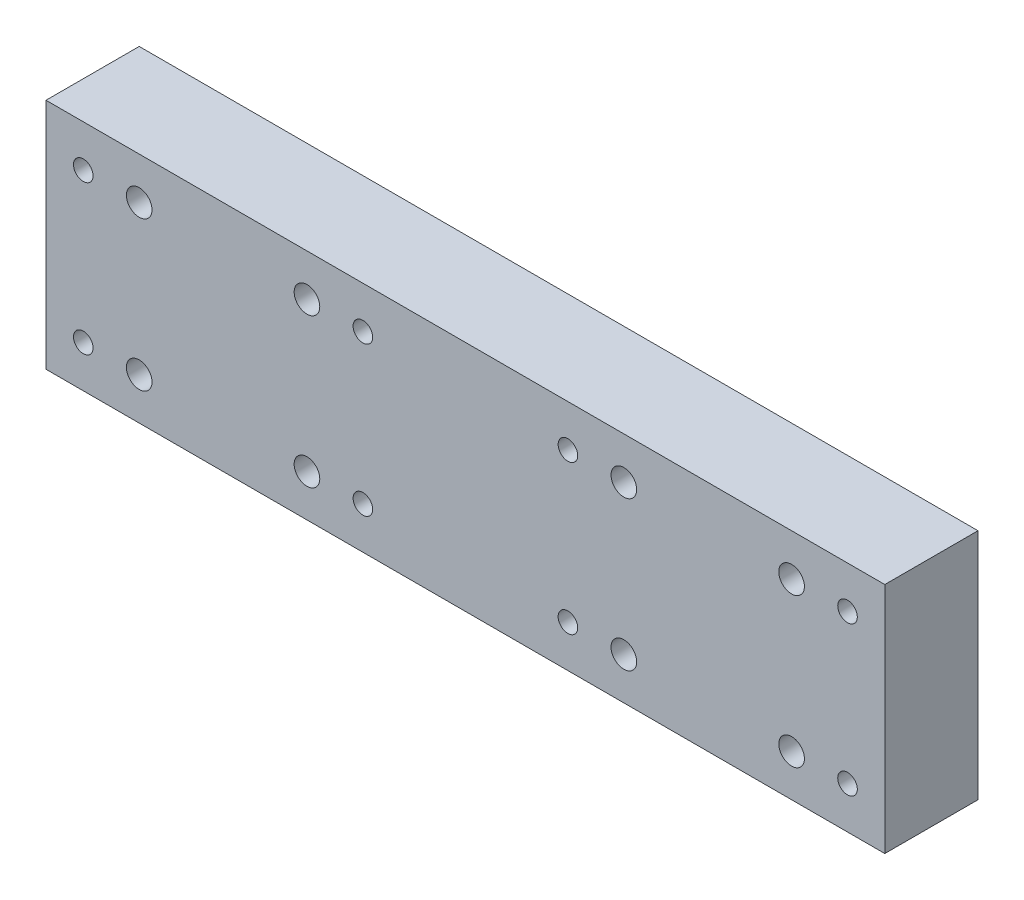
ISO-10303-21;
HEADER;
FILE_DESCRIPTION(('STEP AP214'),'2;1');
FILE_NAME('part.step','',(''),(''),'','','');
FILE_SCHEMA(('AUTOMOTIVE_DESIGN { 1 0 10303 214 1 1 1 1 }'));
ENDSEC;
DATA;
#1=APPLICATION_CONTEXT('core data for automotive mechanical design processes');
#2=APPLICATION_PROTOCOL_DEFINITION('international standard','automotive_design',2000,#1);
#3=PRODUCT_CONTEXT('',#1,'mechanical');
#4=PRODUCT('Part','Part','',(#3));
#5=PRODUCT_RELATED_PRODUCT_CATEGORY('part','',(#4));
#6=PRODUCT_DEFINITION_FORMATION('','',#4);
#7=PRODUCT_DEFINITION_CONTEXT('part definition',#1,'design');
#8=PRODUCT_DEFINITION('design','',#6,#7);
#9=PRODUCT_DEFINITION_SHAPE('','',#8);
#10=(LENGTH_UNIT() NAMED_UNIT(*) SI_UNIT(.MILLI.,.METRE.));
#11=(NAMED_UNIT(*) PLANE_ANGLE_UNIT() SI_UNIT($,.RADIAN.));
#12=(NAMED_UNIT(*) SI_UNIT($,.STERADIAN.) SOLID_ANGLE_UNIT());
#13=UNCERTAINTY_MEASURE_WITH_UNIT(LENGTH_MEASURE(1.E-05),#10,'distance_accuracy_value','');
#14=(GEOMETRIC_REPRESENTATION_CONTEXT(3) GLOBAL_UNCERTAINTY_ASSIGNED_CONTEXT((#13)) GLOBAL_UNIT_ASSIGNED_CONTEXT((#10,
#11,#12)) REPRESENTATION_CONTEXT('',''));
#15=CARTESIAN_POINT('',(0.,0.,0.));
#16=DIRECTION('',(0.,0.,1.));
#17=DIRECTION('',(1.,0.,0.));
#18=AXIS2_PLACEMENT_3D('',#15,#16,#17);
#19=CARTESIAN_POINT('',(-90.,0.,20.));
#20=DIRECTION('',(1.,0.,0.));
#21=DIRECTION('',(0.,0.,-1.));
#22=AXIS2_PLACEMENT_3D('',#19,#20,#21);
#23=PLANE('',#22);
#24=DIRECTION('',(0.,-1.,0.));
#25=VECTOR('',#24,1.);
#26=CARTESIAN_POINT('',(-90.,0.,0.));
#27=LINE('',#26,#25);
#28=CARTESIAN_POINT('',(-90.,50.,0.));
#29=VERTEX_POINT('',#28);
#30=CARTESIAN_POINT('',(-90.,0.,0.));
#31=VERTEX_POINT('',#30);
#32=EDGE_CURVE('E103',#29,#31,#27,.T.);
#33=ORIENTED_EDGE('',*,*,#32,.T.);
#34=DIRECTION('',(0.,0.,-1.));
#35=VECTOR('',#34,1.);
#36=CARTESIAN_POINT('',(-90.,0.,20.));
#37=LINE('',#36,#35);
#38=CARTESIAN_POINT('',(-90.,0.,20.));
#39=VERTEX_POINT('',#38);
#40=EDGE_CURVE('E11',#39,#31,#37,.T.);
#41=ORIENTED_EDGE('',*,*,#40,.F.);
#42=DIRECTION('',(0.,-1.,0.));
#43=VECTOR('',#42,1.);
#44=CARTESIAN_POINT('',(-90.,0.,20.));
#45=LINE('',#44,#43);
#46=CARTESIAN_POINT('',(-90.,50.,20.));
#47=VERTEX_POINT('',#46);
#48=EDGE_CURVE('E90',#47,#39,#45,.T.);
#49=ORIENTED_EDGE('',*,*,#48,.F.);
#50=DIRECTION('',(0.,0.,-1.));
#51=VECTOR('',#50,1.);
#52=CARTESIAN_POINT('',(-90.,50.,20.));
#53=LINE('',#52,#51);
#54=EDGE_CURVE('E99',#47,#29,#53,.T.);
#55=ORIENTED_EDGE('',*,*,#54,.T.);
#56=EDGE_LOOP('',(#33,#41,#49,#55));
#57=FACE_BOUND('',#56,.T.);
#58=ADVANCED_FACE('F37',(#57),#23,.F.);
#59=CARTESIAN_POINT('',(-90.,0.,20.));
#60=DIRECTION('',(0.,1.,0.));
#61=DIRECTION('',(0.,0.,1.));
#62=AXIS2_PLACEMENT_3D('',#59,#60,#61);
#63=PLANE('',#62);
#64=DIRECTION('',(1.,0.,0.));
#65=VECTOR('',#64,1.);
#66=CARTESIAN_POINT('',(-90.,0.,0.));
#67=LINE('',#66,#65);
#68=CARTESIAN_POINT('',(90.,0.,0.));
#69=VERTEX_POINT('',#68);
#70=EDGE_CURVE('E94',#31,#69,#67,.T.);
#71=ORIENTED_EDGE('',*,*,#70,.T.);
#72=DIRECTION('',(0.,0.,-1.));
#73=VECTOR('',#72,1.);
#74=CARTESIAN_POINT('',(90.,0.,20.));
#75=LINE('',#74,#73);
#76=CARTESIAN_POINT('',(90.,0.,20.));
#77=VERTEX_POINT('',#76);
#78=EDGE_CURVE('E46',#77,#69,#75,.T.);
#79=ORIENTED_EDGE('',*,*,#78,.F.);
#80=DIRECTION('',(1.,0.,0.));
#81=VECTOR('',#80,1.);
#82=CARTESIAN_POINT('',(-90.,0.,20.));
#83=LINE('',#82,#81);
#84=EDGE_CURVE('E85',#39,#77,#83,.T.);
#85=ORIENTED_EDGE('',*,*,#84,.F.);
#86=ORIENTED_EDGE('',*,*,#40,.T.);
#87=EDGE_LOOP('',(#71,#79,#85,#86));
#88=FACE_BOUND('',#87,.T.);
#89=ADVANCED_FACE('F93',(#88),#63,.F.);
#90=CARTESIAN_POINT('',(90.,0.,20.));
#91=DIRECTION('',(-1.,0.,0.));
#92=DIRECTION('',(0.,0.,1.));
#93=AXIS2_PLACEMENT_3D('',#90,#91,#92);
#94=PLANE('',#93);
#95=DIRECTION('',(0.,1.,0.));
#96=VECTOR('',#95,1.);
#97=CARTESIAN_POINT('',(90.,0.,0.));
#98=LINE('',#97,#96);
#99=CARTESIAN_POINT('',(90.,50.,0.));
#100=VERTEX_POINT('',#99);
#101=EDGE_CURVE('E72',#69,#100,#98,.T.);
#102=ORIENTED_EDGE('',*,*,#101,.T.);
#103=DIRECTION('',(0.,0.,-1.));
#104=VECTOR('',#103,1.);
#105=CARTESIAN_POINT('',(90.,50.,20.));
#106=LINE('',#105,#104);
#107=CARTESIAN_POINT('',(90.,50.,20.));
#108=VERTEX_POINT('',#107);
#109=EDGE_CURVE('E95',#108,#100,#106,.T.);
#110=ORIENTED_EDGE('',*,*,#109,.F.);
#111=DIRECTION('',(0.,1.,0.));
#112=VECTOR('',#111,1.);
#113=CARTESIAN_POINT('',(90.,0.,20.));
#114=LINE('',#113,#112);
#115=EDGE_CURVE('E88',#77,#108,#114,.T.);
#116=ORIENTED_EDGE('',*,*,#115,.F.);
#117=ORIENTED_EDGE('',*,*,#78,.T.);
#118=EDGE_LOOP('',(#102,#110,#116,#117));
#119=FACE_BOUND('',#118,.T.);
#120=ADVANCED_FACE('F97',(#119),#94,.F.);
#121=CARTESIAN_POINT('',(-90.,50.,20.));
#122=DIRECTION('',(0.,-1.,0.));
#123=DIRECTION('',(0.,0.,-1.));
#124=AXIS2_PLACEMENT_3D('',#121,#122,#123);
#125=PLANE('',#124);
#126=DIRECTION('',(-1.,0.,0.));
#127=VECTOR('',#126,1.);
#128=CARTESIAN_POINT('',(-90.,50.,0.));
#129=LINE('',#128,#127);
#130=EDGE_CURVE('E78',#100,#29,#129,.T.);
#131=ORIENTED_EDGE('',*,*,#130,.T.);
#132=ORIENTED_EDGE('',*,*,#54,.F.);
#133=DIRECTION('',(-1.,0.,0.));
#134=VECTOR('',#133,1.);
#135=CARTESIAN_POINT('',(-90.,50.,20.));
#136=LINE('',#135,#134);
#137=EDGE_CURVE('E55',#108,#47,#136,.T.);
#138=ORIENTED_EDGE('',*,*,#137,.F.);
#139=ORIENTED_EDGE('',*,*,#109,.T.);
#140=EDGE_LOOP('',(#131,#132,#138,#139));
#141=FACE_BOUND('',#140,.T.);
#142=ADVANCED_FACE('F167',(#141),#125,.F.);
#143=CARTESIAN_POINT('',(0.,0.,20.));
#144=DIRECTION('',(0.,0.,-1.));
#145=DIRECTION('',(-1.,0.,0.));
#146=AXIS2_PLACEMENT_3D('',#143,#144,#145);
#147=PLANE('',#146);
#148=CARTESIAN_POINT('',(-82.,41.,20.));
#149=DIRECTION('',(0.,0.,-1.));
#150=DIRECTION('',(-1.,0.,0.));
#151=AXIS2_PLACEMENT_3D('',#148,#149,#150);
#152=CIRCLE('',#151,2.09999999999999);
#153=CARTESIAN_POINT('',(-84.1,41.,20.));
#154=VERTEX_POINT('',#153);
#155=EDGE_CURVE('E530',#154,#154,#152,.T.);
#156=ORIENTED_EDGE('',*,*,#155,.T.);
#157=EDGE_LOOP('',(#156));
#158=FACE_BOUND('',#157,.T.);
#159=CARTESIAN_POINT('',(-22.,41.,20.));
#160=DIRECTION('',(0.,0.,-1.));
#161=DIRECTION('',(-1.,0.,0.));
#162=AXIS2_PLACEMENT_3D('',#159,#160,#161);
#163=CIRCLE('',#162,2.09999999999999);
#164=CARTESIAN_POINT('',(-24.1,41.,20.));
#165=VERTEX_POINT('',#164);
#166=EDGE_CURVE('E534',#165,#165,#163,.T.);
#167=ORIENTED_EDGE('',*,*,#166,.T.);
#168=EDGE_LOOP('',(#167));
#169=FACE_BOUND('',#168,.T.);
#170=CARTESIAN_POINT('',(-82.,9.,20.));
#171=DIRECTION('',(0.,0.,-1.));
#172=DIRECTION('',(-1.,0.,0.));
#173=AXIS2_PLACEMENT_3D('',#170,#171,#172);
#174=CIRCLE('',#173,2.09999999999999);
#175=CARTESIAN_POINT('',(-84.1,9.,20.));
#176=VERTEX_POINT('',#175);
#177=EDGE_CURVE('E543',#176,#176,#174,.T.);
#178=ORIENTED_EDGE('',*,*,#177,.T.);
#179=EDGE_LOOP('',(#178));
#180=FACE_BOUND('',#179,.T.);
#181=CARTESIAN_POINT('',(-22.,9.,20.));
#182=DIRECTION('',(0.,0.,-1.));
#183=DIRECTION('',(-1.,0.,0.));
#184=AXIS2_PLACEMENT_3D('',#181,#182,#183);
#185=CIRCLE('',#184,2.09999999999999);
#186=CARTESIAN_POINT('',(-24.1,9.,20.));
#187=VERTEX_POINT('',#186);
#188=EDGE_CURVE('E549',#187,#187,#185,.T.);
#189=ORIENTED_EDGE('',*,*,#188,.T.);
#190=EDGE_LOOP('',(#189));
#191=FACE_BOUND('',#190,.T.);
#192=CARTESIAN_POINT('',(82.,9.,20.));
#193=DIRECTION('',(0.,0.,-1.));
#194=DIRECTION('',(-1.,0.,0.));
#195=AXIS2_PLACEMENT_3D('',#192,#193,#194);
#196=CIRCLE('',#195,2.09999999999999);
#197=CARTESIAN_POINT('',(79.9,9.,20.));
#198=VERTEX_POINT('',#197);
#199=EDGE_CURVE('E555',#198,#198,#196,.T.);
#200=ORIENTED_EDGE('',*,*,#199,.T.);
#201=EDGE_LOOP('',(#200));
#202=FACE_BOUND('',#201,.T.);
#203=CARTESIAN_POINT('',(82.,41.,20.));
#204=DIRECTION('',(0.,0.,-1.));
#205=DIRECTION('',(-1.,0.,0.));
#206=AXIS2_PLACEMENT_3D('',#203,#204,#205);
#207=CIRCLE('',#206,2.09999999999999);
#208=CARTESIAN_POINT('',(79.9,41.,20.));
#209=VERTEX_POINT('',#208);
#210=EDGE_CURVE('E561',#209,#209,#207,.T.);
#211=ORIENTED_EDGE('',*,*,#210,.T.);
#212=EDGE_LOOP('',(#211));
#213=FACE_BOUND('',#212,.T.);
#214=CARTESIAN_POINT('',(22.,41.,20.));
#215=DIRECTION('',(0.,0.,-1.));
#216=DIRECTION('',(-1.,0.,0.));
#217=AXIS2_PLACEMENT_3D('',#214,#215,#216);
#218=CIRCLE('',#217,2.09999999999999);
#219=CARTESIAN_POINT('',(19.9,41.,20.));
#220=VERTEX_POINT('',#219);
#221=EDGE_CURVE('E567',#220,#220,#218,.T.);
#222=ORIENTED_EDGE('',*,*,#221,.T.);
#223=EDGE_LOOP('',(#222));
#224=FACE_BOUND('',#223,.T.);
#225=CARTESIAN_POINT('',(22.,9.,20.));
#226=DIRECTION('',(0.,0.,-1.));
#227=DIRECTION('',(-1.,0.,0.));
#228=AXIS2_PLACEMENT_3D('',#225,#226,#227);
#229=CIRCLE('',#228,2.09999999999999);
#230=CARTESIAN_POINT('',(19.9,9.,20.));
#231=VERTEX_POINT('',#230);
#232=EDGE_CURVE('E573',#231,#231,#229,.T.);
#233=ORIENTED_EDGE('',*,*,#232,.T.);
#234=EDGE_LOOP('',(#233));
#235=FACE_BOUND('',#234,.T.);
#236=CARTESIAN_POINT('',(70.,9.,20.));
#237=DIRECTION('',(0.,0.,1.));
#238=DIRECTION('',(1.,0.,0.));
#239=AXIS2_PLACEMENT_3D('',#236,#237,#238);
#240=CIRCLE('',#239,2.75000000000001);
#241=CARTESIAN_POINT('',(72.75,9.,20.));
#242=VERTEX_POINT('',#241);
#243=EDGE_CURVE('E148',#242,#242,#240,.T.);
#244=ORIENTED_EDGE('',*,*,#243,.F.);
#245=EDGE_LOOP('',(#244));
#246=FACE_BOUND('',#245,.T.);
#247=CARTESIAN_POINT('',(70.,41.,20.));
#248=DIRECTION('',(0.,0.,1.));
#249=DIRECTION('',(-1.,0.,0.));
#250=AXIS2_PLACEMENT_3D('',#247,#248,#249);
#251=CIRCLE('',#250,2.75000000000001);
#252=CARTESIAN_POINT('',(67.25,41.,20.));
#253=VERTEX_POINT('',#252);
#254=EDGE_CURVE('E151',#253,#253,#251,.T.);
#255=ORIENTED_EDGE('',*,*,#254,.F.);
#256=EDGE_LOOP('',(#255));
#257=FACE_BOUND('',#256,.T.);
#258=CARTESIAN_POINT('',(34.,41.,20.));
#259=DIRECTION('',(0.,0.,1.));
#260=DIRECTION('',(-1.,0.,0.));
#261=AXIS2_PLACEMENT_3D('',#258,#259,#260);
#262=CIRCLE('',#261,2.75);
#263=CARTESIAN_POINT('',(31.25,41.,20.));
#264=VERTEX_POINT('',#263);
#265=EDGE_CURVE('E154',#264,#264,#262,.T.);
#266=ORIENTED_EDGE('',*,*,#265,.F.);
#267=EDGE_LOOP('',(#266));
#268=FACE_BOUND('',#267,.T.);
#269=CARTESIAN_POINT('',(-34.,9.,20.));
#270=DIRECTION('',(0.,0.,1.));
#271=DIRECTION('',(-1.,0.,0.));
#272=AXIS2_PLACEMENT_3D('',#269,#270,#271);
#273=CIRCLE('',#272,2.74999999999999);
#274=CARTESIAN_POINT('',(-36.75,9.,20.));
#275=VERTEX_POINT('',#274);
#276=EDGE_CURVE('E157',#275,#275,#273,.T.);
#277=ORIENTED_EDGE('',*,*,#276,.F.);
#278=EDGE_LOOP('',(#277));
#279=FACE_BOUND('',#278,.T.);
#280=CARTESIAN_POINT('',(-70.,9.,20.));
#281=DIRECTION('',(0.,0.,1.));
#282=DIRECTION('',(-1.,0.,0.));
#283=AXIS2_PLACEMENT_3D('',#280,#281,#282);
#284=CIRCLE('',#283,2.75000000000001);
#285=CARTESIAN_POINT('',(-72.75,9.,20.));
#286=VERTEX_POINT('',#285);
#287=EDGE_CURVE('E144',#286,#286,#284,.T.);
#288=ORIENTED_EDGE('',*,*,#287,.F.);
#289=EDGE_LOOP('',(#288));
#290=FACE_BOUND('',#289,.T.);
#291=CARTESIAN_POINT('',(-70.,41.,20.));
#292=DIRECTION('',(0.,0.,1.));
#293=DIRECTION('',(1.,0.,0.));
#294=AXIS2_PLACEMENT_3D('',#291,#292,#293);
#295=CIRCLE('',#294,2.75000000000001);
#296=CARTESIAN_POINT('',(-67.25,41.,20.));
#297=VERTEX_POINT('',#296);
#298=EDGE_CURVE('E139',#297,#297,#295,.T.);
#299=ORIENTED_EDGE('',*,*,#298,.F.);
#300=EDGE_LOOP('',(#299));
#301=FACE_BOUND('',#300,.T.);
#302=CARTESIAN_POINT('',(-34.,41.,20.));
#303=DIRECTION('',(0.,0.,1.));
#304=DIRECTION('',(1.,0.,0.));
#305=AXIS2_PLACEMENT_3D('',#302,#303,#304);
#306=CIRCLE('',#305,2.75);
#307=CARTESIAN_POINT('',(-31.25,41.,20.));
#308=VERTEX_POINT('',#307);
#309=EDGE_CURVE('E135',#308,#308,#306,.T.);
#310=ORIENTED_EDGE('',*,*,#309,.F.);
#311=EDGE_LOOP('',(#310));
#312=FACE_BOUND('',#311,.T.);
#313=CARTESIAN_POINT('',(34.,9.,20.));
#314=DIRECTION('',(0.,0.,1.));
#315=DIRECTION('',(1.,0.,0.));
#316=AXIS2_PLACEMENT_3D('',#313,#314,#315);
#317=CIRCLE('',#316,2.74999999999999);
#318=CARTESIAN_POINT('',(36.75,9.,20.));
#319=VERTEX_POINT('',#318);
#320=EDGE_CURVE('E106',#319,#319,#317,.T.);
#321=ORIENTED_EDGE('',*,*,#320,.F.);
#322=EDGE_LOOP('',(#321));
#323=FACE_BOUND('',#322,.T.);
#324=ORIENTED_EDGE('',*,*,#48,.T.);
#325=ORIENTED_EDGE('',*,*,#84,.T.);
#326=ORIENTED_EDGE('',*,*,#115,.T.);
#327=ORIENTED_EDGE('',*,*,#137,.T.);
#328=EDGE_LOOP('',(#324,#325,#326,#327));
#329=FACE_BOUND('',#328,.T.);
#330=ADVANCED_FACE('F86',(#158,#169,#180,#191,#202,#213,#224,#235,#246,#257,#268,#279,#290,#301,
#312,#323,#329),#147,.F.);
#331=CARTESIAN_POINT('',(0.,0.,0.));
#332=DIRECTION('',(0.,0.,-1.));
#333=DIRECTION('',(-1.,0.,0.));
#334=AXIS2_PLACEMENT_3D('',#331,#332,#333);
#335=PLANE('',#334);
#336=CARTESIAN_POINT('',(-82.,41.,0.));
#337=DIRECTION('',(0.,0.,-1.));
#338=DIRECTION('',(-1.,0.,0.));
#339=AXIS2_PLACEMENT_3D('',#336,#337,#338);
#340=CIRCLE('',#339,2.09999999999999);
#341=CARTESIAN_POINT('',(-84.1,41.,0.));
#342=VERTEX_POINT('',#341);
#343=EDGE_CURVE('E528',#342,#342,#340,.T.);
#344=ORIENTED_EDGE('',*,*,#343,.F.);
#345=EDGE_LOOP('',(#344));
#346=FACE_BOUND('',#345,.T.);
#347=CARTESIAN_POINT('',(-22.,41.,0.));
#348=DIRECTION('',(0.,0.,-1.));
#349=DIRECTION('',(-1.,0.,0.));
#350=AXIS2_PLACEMENT_3D('',#347,#348,#349);
#351=CIRCLE('',#350,2.1);
#352=CARTESIAN_POINT('',(-24.1,41.,0.));
#353=VERTEX_POINT('',#352);
#354=EDGE_CURVE('E531',#353,#353,#351,.T.);
#355=ORIENTED_EDGE('',*,*,#354,.F.);
#356=EDGE_LOOP('',(#355));
#357=FACE_BOUND('',#356,.T.);
#358=CARTESIAN_POINT('',(-82.,9.,0.));
#359=DIRECTION('',(0.,0.,-1.));
#360=DIRECTION('',(-1.,0.,0.));
#361=AXIS2_PLACEMENT_3D('',#358,#359,#360);
#362=CIRCLE('',#361,2.09999999999999);
#363=CARTESIAN_POINT('',(-84.1,9.,0.));
#364=VERTEX_POINT('',#363);
#365=EDGE_CURVE('E540',#364,#364,#362,.T.);
#366=ORIENTED_EDGE('',*,*,#365,.F.);
#367=EDGE_LOOP('',(#366));
#368=FACE_BOUND('',#367,.T.);
#369=CARTESIAN_POINT('',(-22.,9.,0.));
#370=DIRECTION('',(0.,0.,-1.));
#371=DIRECTION('',(-1.,0.,0.));
#372=AXIS2_PLACEMENT_3D('',#369,#370,#371);
#373=CIRCLE('',#372,2.1);
#374=CARTESIAN_POINT('',(-24.1,9.,0.));
#375=VERTEX_POINT('',#374);
#376=EDGE_CURVE('E546',#375,#375,#373,.T.);
#377=ORIENTED_EDGE('',*,*,#376,.F.);
#378=EDGE_LOOP('',(#377));
#379=FACE_BOUND('',#378,.T.);
#380=CARTESIAN_POINT('',(82.,9.,0.));
#381=DIRECTION('',(0.,0.,-1.));
#382=DIRECTION('',(-1.,0.,0.));
#383=AXIS2_PLACEMENT_3D('',#380,#381,#382);
#384=CIRCLE('',#383,2.09999999999999);
#385=CARTESIAN_POINT('',(79.9,9.,0.));
#386=VERTEX_POINT('',#385);
#387=EDGE_CURVE('E552',#386,#386,#384,.T.);
#388=ORIENTED_EDGE('',*,*,#387,.F.);
#389=EDGE_LOOP('',(#388));
#390=FACE_BOUND('',#389,.T.);
#391=CARTESIAN_POINT('',(82.,41.,0.));
#392=DIRECTION('',(0.,0.,-1.));
#393=DIRECTION('',(-1.,0.,0.));
#394=AXIS2_PLACEMENT_3D('',#391,#392,#393);
#395=CIRCLE('',#394,2.09999999999999);
#396=CARTESIAN_POINT('',(79.9,41.,0.));
#397=VERTEX_POINT('',#396);
#398=EDGE_CURVE('E558',#397,#397,#395,.T.);
#399=ORIENTED_EDGE('',*,*,#398,.F.);
#400=EDGE_LOOP('',(#399));
#401=FACE_BOUND('',#400,.T.);
#402=CARTESIAN_POINT('',(22.,41.,0.));
#403=DIRECTION('',(0.,0.,-1.));
#404=DIRECTION('',(-1.,0.,0.));
#405=AXIS2_PLACEMENT_3D('',#402,#403,#404);
#406=CIRCLE('',#405,2.1);
#407=CARTESIAN_POINT('',(19.9,41.,0.));
#408=VERTEX_POINT('',#407);
#409=EDGE_CURVE('E564',#408,#408,#406,.T.);
#410=ORIENTED_EDGE('',*,*,#409,.F.);
#411=EDGE_LOOP('',(#410));
#412=FACE_BOUND('',#411,.T.);
#413=CARTESIAN_POINT('',(22.,9.,0.));
#414=DIRECTION('',(0.,0.,-1.));
#415=DIRECTION('',(-1.,0.,0.));
#416=AXIS2_PLACEMENT_3D('',#413,#414,#415);
#417=CIRCLE('',#416,2.1);
#418=CARTESIAN_POINT('',(19.9,9.,0.));
#419=VERTEX_POINT('',#418);
#420=EDGE_CURVE('E570',#419,#419,#417,.T.);
#421=ORIENTED_EDGE('',*,*,#420,.F.);
#422=EDGE_LOOP('',(#421));
#423=FACE_BOUND('',#422,.T.);
#424=CARTESIAN_POINT('',(-34.,41.,0.));
#425=DIRECTION('',(0.,0.,1.));
#426=DIRECTION('',(1.,0.,0.));
#427=AXIS2_PLACEMENT_3D('',#424,#425,#426);
#428=CIRCLE('',#427,5.);
#429=CARTESIAN_POINT('',(-29.,41.,0.));
#430=VERTEX_POINT('',#429);
#431=EDGE_CURVE('E599',#430,#430,#428,.T.);
#432=ORIENTED_EDGE('',*,*,#431,.T.);
#433=EDGE_LOOP('',(#432));
#434=FACE_BOUND('',#433,.T.);
#435=CARTESIAN_POINT('',(34.,41.,0.));
#436=DIRECTION('',(0.,0.,1.));
#437=DIRECTION('',(1.,0.,0.));
#438=AXIS2_PLACEMENT_3D('',#435,#436,#437);
#439=CIRCLE('',#438,5.);
#440=CARTESIAN_POINT('',(39.,41.,0.));
#441=VERTEX_POINT('',#440);
#442=EDGE_CURVE('E605',#441,#441,#439,.T.);
#443=ORIENTED_EDGE('',*,*,#442,.T.);
#444=EDGE_LOOP('',(#443));
#445=FACE_BOUND('',#444,.T.);
#446=CARTESIAN_POINT('',(70.,41.,0.));
#447=DIRECTION('',(0.,0.,1.));
#448=DIRECTION('',(1.,0.,0.));
#449=AXIS2_PLACEMENT_3D('',#446,#447,#448);
#450=CIRCLE('',#449,5.00000000000001);
#451=CARTESIAN_POINT('',(75.,41.,0.));
#452=VERTEX_POINT('',#451);
#453=EDGE_CURVE('E611',#452,#452,#450,.T.);
#454=ORIENTED_EDGE('',*,*,#453,.T.);
#455=EDGE_LOOP('',(#454));
#456=FACE_BOUND('',#455,.T.);
#457=CARTESIAN_POINT('',(70.,9.,0.));
#458=DIRECTION('',(0.,0.,1.));
#459=DIRECTION('',(1.,0.,0.));
#460=AXIS2_PLACEMENT_3D('',#457,#458,#459);
#461=CIRCLE('',#460,5.);
#462=CARTESIAN_POINT('',(75.,9.,0.));
#463=VERTEX_POINT('',#462);
#464=EDGE_CURVE('E580',#463,#463,#461,.T.);
#465=ORIENTED_EDGE('',*,*,#464,.T.);
#466=EDGE_LOOP('',(#465));
#467=FACE_BOUND('',#466,.T.);
#468=CARTESIAN_POINT('',(34.,9.,0.));
#469=DIRECTION('',(0.,0.,1.));
#470=DIRECTION('',(1.,0.,0.));
#471=AXIS2_PLACEMENT_3D('',#468,#469,#470);
#472=CIRCLE('',#471,5.);
#473=CARTESIAN_POINT('',(39.,9.,0.));
#474=VERTEX_POINT('',#473);
#475=EDGE_CURVE('E581',#474,#474,#472,.T.);
#476=ORIENTED_EDGE('',*,*,#475,.T.);
#477=EDGE_LOOP('',(#476));
#478=FACE_BOUND('',#477,.T.);
#479=CARTESIAN_POINT('',(-34.,9.,0.));
#480=DIRECTION('',(0.,0.,1.));
#481=DIRECTION('',(1.,0.,0.));
#482=AXIS2_PLACEMENT_3D('',#479,#480,#481);
#483=CIRCLE('',#482,5.);
#484=CARTESIAN_POINT('',(-29.,9.,0.));
#485=VERTEX_POINT('',#484);
#486=EDGE_CURVE('E587',#485,#485,#483,.T.);
#487=ORIENTED_EDGE('',*,*,#486,.T.);
#488=EDGE_LOOP('',(#487));
#489=FACE_BOUND('',#488,.T.);
#490=CARTESIAN_POINT('',(-70.,9.,0.));
#491=DIRECTION('',(0.,0.,1.));
#492=DIRECTION('',(1.,0.,0.));
#493=AXIS2_PLACEMENT_3D('',#490,#491,#492);
#494=CIRCLE('',#493,5.);
#495=CARTESIAN_POINT('',(-65.,9.,0.));
#496=VERTEX_POINT('',#495);
#497=EDGE_CURVE('E576',#496,#496,#494,.T.);
#498=ORIENTED_EDGE('',*,*,#497,.T.);
#499=EDGE_LOOP('',(#498));
#500=FACE_BOUND('',#499,.T.);
#501=CARTESIAN_POINT('',(-70.,41.,0.));
#502=DIRECTION('',(0.,0.,1.));
#503=DIRECTION('',(1.,0.,0.));
#504=AXIS2_PLACEMENT_3D('',#501,#502,#503);
#505=CIRCLE('',#504,5.00000000000001);
#506=CARTESIAN_POINT('',(-65.,41.,0.));
#507=VERTEX_POINT('',#506);
#508=EDGE_CURVE('E598',#507,#507,#505,.T.);
#509=ORIENTED_EDGE('',*,*,#508,.T.);
#510=EDGE_LOOP('',(#509));
#511=FACE_BOUND('',#510,.T.);
#512=ORIENTED_EDGE('',*,*,#32,.F.);
#513=ORIENTED_EDGE('',*,*,#130,.F.);
#514=ORIENTED_EDGE('',*,*,#101,.F.);
#515=ORIENTED_EDGE('',*,*,#70,.F.);
#516=EDGE_LOOP('',(#512,#513,#514,#515));
#517=FACE_BOUND('',#516,.T.);
#518=ADVANCED_FACE('F166',(#346,#357,#368,#379,#390,#401,#412,#423,#434,#445,#456,#467,#478,
#489,#500,#511,#517),#335,.T.);
#519=CARTESIAN_POINT('',(34.,9.,-20.));
#520=DIRECTION('',(0.,0.,1.));
#521=DIRECTION('',(1.,0.,0.));
#522=AXIS2_PLACEMENT_3D('',#519,#520,#521);
#523=CYLINDRICAL_SURFACE('',#522,2.74999999999999);
#524=CARTESIAN_POINT('',(34.,9.,6.));
#525=DIRECTION('',(0.,0.,1.));
#526=DIRECTION('',(1.,0.,0.));
#527=AXIS2_PLACEMENT_3D('',#524,#525,#526);
#528=CIRCLE('',#527,2.74999999999999);
#529=CARTESIAN_POINT('',(36.75,9.,6.));
#530=VERTEX_POINT('',#529);
#531=EDGE_CURVE('E40',#530,#530,#528,.F.);
#532=ORIENTED_EDGE('',*,*,#531,.T.);
#533=EDGE_LOOP('',(#532));
#534=FACE_BOUND('',#533,.T.);
#535=ORIENTED_EDGE('',*,*,#320,.T.);
#536=EDGE_LOOP('',(#535));
#537=FACE_BOUND('',#536,.T.);
#538=ADVANCED_FACE('F163',(#534,#537),#523,.F.);
#539=CARTESIAN_POINT('',(-34.,41.,-20.));
#540=DIRECTION('',(0.,0.,1.));
#541=DIRECTION('',(1.,0.,0.));
#542=AXIS2_PLACEMENT_3D('',#539,#540,#541);
#543=CYLINDRICAL_SURFACE('',#542,2.75);
#544=CARTESIAN_POINT('',(-34.,41.,6.));
#545=DIRECTION('',(0.,0.,1.));
#546=DIRECTION('',(1.,0.,0.));
#547=AXIS2_PLACEMENT_3D('',#544,#545,#546);
#548=CIRCLE('',#547,2.75);
#549=CARTESIAN_POINT('',(-31.25,41.,6.));
#550=VERTEX_POINT('',#549);
#551=EDGE_CURVE('E130',#550,#550,#548,.F.);
#552=ORIENTED_EDGE('',*,*,#551,.T.);
#553=EDGE_LOOP('',(#552));
#554=FACE_BOUND('',#553,.T.);
#555=ORIENTED_EDGE('',*,*,#309,.T.);
#556=EDGE_LOOP('',(#555));
#557=FACE_BOUND('',#556,.T.);
#558=ADVANCED_FACE('F216',(#554,#557),#543,.F.);
#559=CARTESIAN_POINT('',(-70.,41.,-20.));
#560=DIRECTION('',(0.,0.,1.));
#561=DIRECTION('',(1.,0.,0.));
#562=AXIS2_PLACEMENT_3D('',#559,#560,#561);
#563=CYLINDRICAL_SURFACE('',#562,2.75000000000001);
#564=CARTESIAN_POINT('',(-70.,41.,6.));
#565=DIRECTION('',(0.,0.,1.));
#566=DIRECTION('',(1.,0.,0.));
#567=AXIS2_PLACEMENT_3D('',#564,#565,#566);
#568=CIRCLE('',#567,2.75000000000001);
#569=CARTESIAN_POINT('',(-67.25,41.,6.));
#570=VERTEX_POINT('',#569);
#571=EDGE_CURVE('E128',#570,#570,#568,.F.);
#572=ORIENTED_EDGE('',*,*,#571,.T.);
#573=EDGE_LOOP('',(#572));
#574=FACE_BOUND('',#573,.T.);
#575=ORIENTED_EDGE('',*,*,#298,.T.);
#576=EDGE_LOOP('',(#575));
#577=FACE_BOUND('',#576,.T.);
#578=ADVANCED_FACE('F224',(#574,#577),#563,.F.);
#579=CARTESIAN_POINT('',(-70.,9.,-20.));
#580=DIRECTION('',(0.,0.,1.));
#581=DIRECTION('',(1.,0.,0.));
#582=AXIS2_PLACEMENT_3D('',#579,#580,#581);
#583=CYLINDRICAL_SURFACE('',#582,2.75000000000001);
#584=CARTESIAN_POINT('',(-70.,9.,6.));
#585=DIRECTION('',(0.,0.,1.));
#586=DIRECTION('',(1.,0.,0.));
#587=AXIS2_PLACEMENT_3D('',#584,#585,#586);
#588=CIRCLE('',#587,2.75000000000001);
#589=CARTESIAN_POINT('',(-67.25,9.,6.));
#590=VERTEX_POINT('',#589);
#591=EDGE_CURVE('E125',#590,#590,#588,.F.);
#592=ORIENTED_EDGE('',*,*,#591,.T.);
#593=EDGE_LOOP('',(#592));
#594=FACE_BOUND('',#593,.T.);
#595=ORIENTED_EDGE('',*,*,#287,.T.);
#596=EDGE_LOOP('',(#595));
#597=FACE_BOUND('',#596,.T.);
#598=ADVANCED_FACE('F233',(#594,#597),#583,.F.);
#599=CARTESIAN_POINT('',(-34.,9.,-20.));
#600=DIRECTION('',(0.,0.,1.));
#601=DIRECTION('',(1.,0.,0.));
#602=AXIS2_PLACEMENT_3D('',#599,#600,#601);
#603=CYLINDRICAL_SURFACE('',#602,2.74999999999999);
#604=CARTESIAN_POINT('',(-34.,9.,6.));
#605=DIRECTION('',(0.,0.,1.));
#606=DIRECTION('',(1.,0.,0.));
#607=AXIS2_PLACEMENT_3D('',#604,#605,#606);
#608=CIRCLE('',#607,2.74999999999999);
#609=CARTESIAN_POINT('',(-31.25,9.,6.));
#610=VERTEX_POINT('',#609);
#611=EDGE_CURVE('E122',#610,#610,#608,.F.);
#612=ORIENTED_EDGE('',*,*,#611,.T.);
#613=EDGE_LOOP('',(#612));
#614=FACE_BOUND('',#613,.T.);
#615=ORIENTED_EDGE('',*,*,#276,.T.);
#616=EDGE_LOOP('',(#615));
#617=FACE_BOUND('',#616,.T.);
#618=ADVANCED_FACE('F243',(#614,#617),#603,.F.);
#619=CARTESIAN_POINT('',(34.,41.,-20.));
#620=DIRECTION('',(0.,0.,1.));
#621=DIRECTION('',(1.,0.,0.));
#622=AXIS2_PLACEMENT_3D('',#619,#620,#621);
#623=CYLINDRICAL_SURFACE('',#622,2.75);
#624=CARTESIAN_POINT('',(34.,41.,6.));
#625=DIRECTION('',(0.,0.,1.));
#626=DIRECTION('',(1.,0.,0.));
#627=AXIS2_PLACEMENT_3D('',#624,#625,#626);
#628=CIRCLE('',#627,2.75);
#629=CARTESIAN_POINT('',(36.75,41.,6.));
#630=VERTEX_POINT('',#629);
#631=EDGE_CURVE('E119',#630,#630,#628,.F.);
#632=ORIENTED_EDGE('',*,*,#631,.T.);
#633=EDGE_LOOP('',(#632));
#634=FACE_BOUND('',#633,.T.);
#635=ORIENTED_EDGE('',*,*,#265,.T.);
#636=EDGE_LOOP('',(#635));
#637=FACE_BOUND('',#636,.T.);
#638=ADVANCED_FACE('F253',(#634,#637),#623,.F.);
#639=CARTESIAN_POINT('',(70.,41.,-20.));
#640=DIRECTION('',(0.,0.,1.));
#641=DIRECTION('',(1.,0.,0.));
#642=AXIS2_PLACEMENT_3D('',#639,#640,#641);
#643=CYLINDRICAL_SURFACE('',#642,2.75000000000001);
#644=CARTESIAN_POINT('',(70.,41.,6.));
#645=DIRECTION('',(0.,0.,1.));
#646=DIRECTION('',(1.,0.,0.));
#647=AXIS2_PLACEMENT_3D('',#644,#645,#646);
#648=CIRCLE('',#647,2.75000000000001);
#649=CARTESIAN_POINT('',(72.75,41.,6.));
#650=VERTEX_POINT('',#649);
#651=EDGE_CURVE('E115',#650,#650,#648,.F.);
#652=ORIENTED_EDGE('',*,*,#651,.T.);
#653=EDGE_LOOP('',(#652));
#654=FACE_BOUND('',#653,.T.);
#655=ORIENTED_EDGE('',*,*,#254,.T.);
#656=EDGE_LOOP('',(#655));
#657=FACE_BOUND('',#656,.T.);
#658=ADVANCED_FACE('F263',(#654,#657),#643,.F.);
#659=CARTESIAN_POINT('',(70.,9.,-20.));
#660=DIRECTION('',(0.,0.,1.));
#661=DIRECTION('',(1.,0.,0.));
#662=AXIS2_PLACEMENT_3D('',#659,#660,#661);
#663=CYLINDRICAL_SURFACE('',#662,2.75000000000001);
#664=CARTESIAN_POINT('',(70.,9.,6.));
#665=DIRECTION('',(0.,0.,1.));
#666=DIRECTION('',(1.,0.,0.));
#667=AXIS2_PLACEMENT_3D('',#664,#665,#666);
#668=CIRCLE('',#667,2.75000000000001);
#669=CARTESIAN_POINT('',(72.75,9.,6.));
#670=VERTEX_POINT('',#669);
#671=EDGE_CURVE('E112',#670,#670,#668,.F.);
#672=ORIENTED_EDGE('',*,*,#671,.T.);
#673=EDGE_LOOP('',(#672));
#674=FACE_BOUND('',#673,.T.);
#675=ORIENTED_EDGE('',*,*,#243,.T.);
#676=EDGE_LOOP('',(#675));
#677=FACE_BOUND('',#676,.T.);
#678=ADVANCED_FACE('F273',(#674,#677),#663,.F.);
#679=CARTESIAN_POINT('',(70.,9.,6.));
#680=DIRECTION('',(0.,0.,1.));
#681=DIRECTION('',(1.,0.,0.));
#682=AXIS2_PLACEMENT_3D('',#679,#680,#681);
#683=PLANE('',#682);
#684=CARTESIAN_POINT('',(70.,9.,6.));
#685=DIRECTION('',(0.,0.,1.));
#686=DIRECTION('',(1.,0.,0.));
#687=AXIS2_PLACEMENT_3D('',#684,#685,#686);
#688=CIRCLE('',#687,5.);
#689=CARTESIAN_POINT('',(75.,9.,6.));
#690=VERTEX_POINT('',#689);
#691=EDGE_CURVE('E614',#690,#690,#688,.T.);
#692=ORIENTED_EDGE('',*,*,#691,.F.);
#693=EDGE_LOOP('',(#692));
#694=FACE_BOUND('',#693,.T.);
#695=ORIENTED_EDGE('',*,*,#671,.F.);
#696=EDGE_LOOP('',(#695));
#697=FACE_BOUND('',#696,.T.);
#698=ADVANCED_FACE('F283',(#694,#697),#683,.F.);
#699=CARTESIAN_POINT('',(70.,9.,6.));
#700=DIRECTION('',(0.,0.,-1.));
#701=DIRECTION('',(-1.,0.,0.));
#702=AXIS2_PLACEMENT_3D('',#699,#700,#701);
#703=CYLINDRICAL_SURFACE('',#702,5.);
#704=ORIENTED_EDGE('',*,*,#691,.T.);
#705=EDGE_LOOP('',(#704));
#706=FACE_BOUND('',#705,.T.);
#707=ORIENTED_EDGE('',*,*,#464,.F.);
#708=EDGE_LOOP('',(#707));
#709=FACE_BOUND('',#708,.T.);
#710=ADVANCED_FACE('F293',(#706,#709),#703,.F.);
#711=CARTESIAN_POINT('',(70.,41.,6.));
#712=DIRECTION('',(0.,0.,1.));
#713=DIRECTION('',(1.,0.,0.));
#714=AXIS2_PLACEMENT_3D('',#711,#712,#713);
#715=PLANE('',#714);
#716=CARTESIAN_POINT('',(70.,41.,6.));
#717=DIRECTION('',(0.,0.,1.));
#718=DIRECTION('',(1.,0.,0.));
#719=AXIS2_PLACEMENT_3D('',#716,#717,#718);
#720=CIRCLE('',#719,5.00000000000001);
#721=CARTESIAN_POINT('',(75.,41.,6.));
#722=VERTEX_POINT('',#721);
#723=EDGE_CURVE('E608',#722,#722,#720,.T.);
#724=ORIENTED_EDGE('',*,*,#723,.F.);
#725=EDGE_LOOP('',(#724));
#726=FACE_BOUND('',#725,.T.);
#727=ORIENTED_EDGE('',*,*,#651,.F.);
#728=EDGE_LOOP('',(#727));
#729=FACE_BOUND('',#728,.T.);
#730=ADVANCED_FACE('F300',(#726,#729),#715,.F.);
#731=CARTESIAN_POINT('',(70.,41.,6.));
#732=DIRECTION('',(0.,0.,-1.));
#733=DIRECTION('',(-1.,0.,0.));
#734=AXIS2_PLACEMENT_3D('',#731,#732,#733);
#735=CYLINDRICAL_SURFACE('',#734,5.00000000000001);
#736=ORIENTED_EDGE('',*,*,#723,.T.);
#737=EDGE_LOOP('',(#736));
#738=FACE_BOUND('',#737,.T.);
#739=ORIENTED_EDGE('',*,*,#453,.F.);
#740=EDGE_LOOP('',(#739));
#741=FACE_BOUND('',#740,.T.);
#742=ADVANCED_FACE('F308',(#738,#741),#735,.F.);
#743=CARTESIAN_POINT('',(34.,41.,6.));
#744=DIRECTION('',(0.,0.,1.));
#745=DIRECTION('',(1.,0.,0.));
#746=AXIS2_PLACEMENT_3D('',#743,#744,#745);
#747=PLANE('',#746);
#748=CARTESIAN_POINT('',(34.,41.,6.));
#749=DIRECTION('',(0.,0.,1.));
#750=DIRECTION('',(1.,0.,0.));
#751=AXIS2_PLACEMENT_3D('',#748,#749,#750);
#752=CIRCLE('',#751,5.);
#753=CARTESIAN_POINT('',(39.,41.,6.));
#754=VERTEX_POINT('',#753);
#755=EDGE_CURVE('E602',#754,#754,#752,.T.);
#756=ORIENTED_EDGE('',*,*,#755,.F.);
#757=EDGE_LOOP('',(#756));
#758=FACE_BOUND('',#757,.T.);
#759=ORIENTED_EDGE('',*,*,#631,.F.);
#760=EDGE_LOOP('',(#759));
#761=FACE_BOUND('',#760,.T.);
#762=ADVANCED_FACE('F316',(#758,#761),#747,.F.);
#763=CARTESIAN_POINT('',(34.,41.,6.));
#764=DIRECTION('',(0.,0.,-1.));
#765=DIRECTION('',(-1.,0.,0.));
#766=AXIS2_PLACEMENT_3D('',#763,#764,#765);
#767=CYLINDRICAL_SURFACE('',#766,5.);
#768=ORIENTED_EDGE('',*,*,#755,.T.);
#769=EDGE_LOOP('',(#768));
#770=FACE_BOUND('',#769,.T.);
#771=ORIENTED_EDGE('',*,*,#442,.F.);
#772=EDGE_LOOP('',(#771));
#773=FACE_BOUND('',#772,.T.);
#774=ADVANCED_FACE('F324',(#770,#773),#767,.F.);
#775=CARTESIAN_POINT('',(-34.,9.,6.));
#776=DIRECTION('',(0.,0.,1.));
#777=DIRECTION('',(1.,0.,0.));
#778=AXIS2_PLACEMENT_3D('',#775,#776,#777);
#779=PLANE('',#778);
#780=CARTESIAN_POINT('',(-34.,9.,6.));
#781=DIRECTION('',(0.,0.,1.));
#782=DIRECTION('',(1.,0.,0.));
#783=AXIS2_PLACEMENT_3D('',#780,#781,#782);
#784=CIRCLE('',#783,5.);
#785=CARTESIAN_POINT('',(-29.,9.,6.));
#786=VERTEX_POINT('',#785);
#787=EDGE_CURVE('E584',#786,#786,#784,.T.);
#788=ORIENTED_EDGE('',*,*,#787,.F.);
#789=EDGE_LOOP('',(#788));
#790=FACE_BOUND('',#789,.T.);
#791=ORIENTED_EDGE('',*,*,#611,.F.);
#792=EDGE_LOOP('',(#791));
#793=FACE_BOUND('',#792,.T.);
#794=ADVANCED_FACE('F332',(#790,#793),#779,.F.);
#795=CARTESIAN_POINT('',(-34.,9.,6.));
#796=DIRECTION('',(0.,0.,-1.));
#797=DIRECTION('',(-1.,0.,0.));
#798=AXIS2_PLACEMENT_3D('',#795,#796,#797);
#799=CYLINDRICAL_SURFACE('',#798,5.);
#800=ORIENTED_EDGE('',*,*,#787,.T.);
#801=EDGE_LOOP('',(#800));
#802=FACE_BOUND('',#801,.T.);
#803=ORIENTED_EDGE('',*,*,#486,.F.);
#804=EDGE_LOOP('',(#803));
#805=FACE_BOUND('',#804,.T.);
#806=ADVANCED_FACE('F340',(#802,#805),#799,.F.);
#807=CARTESIAN_POINT('',(-70.,9.,6.));
#808=DIRECTION('',(0.,0.,1.));
#809=DIRECTION('',(1.,0.,0.));
#810=AXIS2_PLACEMENT_3D('',#807,#808,#809);
#811=PLANE('',#810);
#812=CARTESIAN_POINT('',(-70.,9.,6.));
#813=DIRECTION('',(0.,0.,1.));
#814=DIRECTION('',(1.,0.,0.));
#815=AXIS2_PLACEMENT_3D('',#812,#813,#814);
#816=CIRCLE('',#815,5.);
#817=CARTESIAN_POINT('',(-65.,9.,6.));
#818=VERTEX_POINT('',#817);
#819=EDGE_CURVE('E590',#818,#818,#816,.T.);
#820=ORIENTED_EDGE('',*,*,#819,.F.);
#821=EDGE_LOOP('',(#820));
#822=FACE_BOUND('',#821,.T.);
#823=ORIENTED_EDGE('',*,*,#591,.F.);
#824=EDGE_LOOP('',(#823));
#825=FACE_BOUND('',#824,.T.);
#826=ADVANCED_FACE('F348',(#822,#825),#811,.F.);
#827=CARTESIAN_POINT('',(-70.,9.,6.));
#828=DIRECTION('',(0.,0.,-1.));
#829=DIRECTION('',(-1.,0.,0.));
#830=AXIS2_PLACEMENT_3D('',#827,#828,#829);
#831=CYLINDRICAL_SURFACE('',#830,5.);
#832=ORIENTED_EDGE('',*,*,#819,.T.);
#833=EDGE_LOOP('',(#832));
#834=FACE_BOUND('',#833,.T.);
#835=ORIENTED_EDGE('',*,*,#497,.F.);
#836=EDGE_LOOP('',(#835));
#837=FACE_BOUND('',#836,.T.);
#838=ADVANCED_FACE('F356',(#834,#837),#831,.F.);
#839=CARTESIAN_POINT('',(-70.,41.,6.));
#840=DIRECTION('',(0.,0.,1.));
#841=DIRECTION('',(1.,0.,0.));
#842=AXIS2_PLACEMENT_3D('',#839,#840,#841);
#843=PLANE('',#842);
#844=CARTESIAN_POINT('',(-70.,41.,6.));
#845=DIRECTION('',(0.,0.,1.));
#846=DIRECTION('',(1.,0.,0.));
#847=AXIS2_PLACEMENT_3D('',#844,#845,#846);
#848=CIRCLE('',#847,5.00000000000001);
#849=CARTESIAN_POINT('',(-65.,41.,6.));
#850=VERTEX_POINT('',#849);
#851=EDGE_CURVE('E116',#850,#850,#848,.T.);
#852=ORIENTED_EDGE('',*,*,#851,.F.);
#853=EDGE_LOOP('',(#852));
#854=FACE_BOUND('',#853,.T.);
#855=ORIENTED_EDGE('',*,*,#571,.F.);
#856=EDGE_LOOP('',(#855));
#857=FACE_BOUND('',#856,.T.);
#858=ADVANCED_FACE('F364',(#854,#857),#843,.F.);
#859=CARTESIAN_POINT('',(-70.,41.,6.));
#860=DIRECTION('',(0.,0.,-1.));
#861=DIRECTION('',(-1.,0.,0.));
#862=AXIS2_PLACEMENT_3D('',#859,#860,#861);
#863=CYLINDRICAL_SURFACE('',#862,5.00000000000001);
#864=ORIENTED_EDGE('',*,*,#851,.T.);
#865=EDGE_LOOP('',(#864));
#866=FACE_BOUND('',#865,.T.);
#867=ORIENTED_EDGE('',*,*,#508,.F.);
#868=EDGE_LOOP('',(#867));
#869=FACE_BOUND('',#868,.T.);
#870=ADVANCED_FACE('F372',(#866,#869),#863,.F.);
#871=CARTESIAN_POINT('',(-34.,41.,6.));
#872=DIRECTION('',(0.,0.,1.));
#873=DIRECTION('',(1.,0.,0.));
#874=AXIS2_PLACEMENT_3D('',#871,#872,#873);
#875=PLANE('',#874);
#876=CARTESIAN_POINT('',(-34.,41.,6.));
#877=DIRECTION('',(0.,0.,1.));
#878=DIRECTION('',(1.,0.,0.));
#879=AXIS2_PLACEMENT_3D('',#876,#877,#878);
#880=CIRCLE('',#879,5.);
#881=CARTESIAN_POINT('',(-29.,41.,6.));
#882=VERTEX_POINT('',#881);
#883=EDGE_CURVE('E595',#882,#882,#880,.T.);
#884=ORIENTED_EDGE('',*,*,#883,.F.);
#885=EDGE_LOOP('',(#884));
#886=FACE_BOUND('',#885,.T.);
#887=ORIENTED_EDGE('',*,*,#551,.F.);
#888=EDGE_LOOP('',(#887));
#889=FACE_BOUND('',#888,.T.);
#890=ADVANCED_FACE('F380',(#886,#889),#875,.F.);
#891=CARTESIAN_POINT('',(-34.,41.,6.));
#892=DIRECTION('',(0.,0.,-1.));
#893=DIRECTION('',(-1.,0.,0.));
#894=AXIS2_PLACEMENT_3D('',#891,#892,#893);
#895=CYLINDRICAL_SURFACE('',#894,5.);
#896=ORIENTED_EDGE('',*,*,#883,.T.);
#897=EDGE_LOOP('',(#896));
#898=FACE_BOUND('',#897,.T.);
#899=ORIENTED_EDGE('',*,*,#431,.F.);
#900=EDGE_LOOP('',(#899));
#901=FACE_BOUND('',#900,.T.);
#902=ADVANCED_FACE('F388',(#898,#901),#895,.F.);
#903=CARTESIAN_POINT('',(34.,9.,6.));
#904=DIRECTION('',(0.,0.,1.));
#905=DIRECTION('',(1.,0.,0.));
#906=AXIS2_PLACEMENT_3D('',#903,#904,#905);
#907=PLANE('',#906);
#908=CARTESIAN_POINT('',(34.,9.,6.));
#909=DIRECTION('',(0.,0.,1.));
#910=DIRECTION('',(1.,0.,0.));
#911=AXIS2_PLACEMENT_3D('',#908,#909,#910);
#912=CIRCLE('',#911,5.);
#913=CARTESIAN_POINT('',(39.,9.,6.));
#914=VERTEX_POINT('',#913);
#915=EDGE_CURVE('E577',#914,#914,#912,.T.);
#916=ORIENTED_EDGE('',*,*,#915,.F.);
#917=EDGE_LOOP('',(#916));
#918=FACE_BOUND('',#917,.T.);
#919=ORIENTED_EDGE('',*,*,#531,.F.);
#920=EDGE_LOOP('',(#919));
#921=FACE_BOUND('',#920,.T.);
#922=ADVANCED_FACE('F396',(#918,#921),#907,.F.);
#923=CARTESIAN_POINT('',(34.,9.,6.));
#924=DIRECTION('',(0.,0.,-1.));
#925=DIRECTION('',(-1.,0.,0.));
#926=AXIS2_PLACEMENT_3D('',#923,#924,#925);
#927=CYLINDRICAL_SURFACE('',#926,5.);
#928=ORIENTED_EDGE('',*,*,#915,.T.);
#929=EDGE_LOOP('',(#928));
#930=FACE_BOUND('',#929,.T.);
#931=ORIENTED_EDGE('',*,*,#475,.F.);
#932=EDGE_LOOP('',(#931));
#933=FACE_BOUND('',#932,.T.);
#934=ADVANCED_FACE('F404',(#930,#933),#927,.F.);
#935=CARTESIAN_POINT('',(22.,9.,0.));
#936=DIRECTION('',(0.,0.,-1.));
#937=DIRECTION('',(-1.,0.,0.));
#938=AXIS2_PLACEMENT_3D('',#935,#936,#937);
#939=CYLINDRICAL_SURFACE('',#938,2.09999999999999);
#940=ORIENTED_EDGE('',*,*,#420,.T.);
#941=EDGE_LOOP('',(#940));
#942=FACE_BOUND('',#941,.T.);
#943=ORIENTED_EDGE('',*,*,#232,.F.);
#944=EDGE_LOOP('',(#943));
#945=FACE_BOUND('',#944,.T.);
#946=ADVANCED_FACE('F411',(#942,#945),#939,.F.);
#947=CARTESIAN_POINT('',(22.,41.,0.));
#948=DIRECTION('',(0.,0.,-1.));
#949=DIRECTION('',(-1.,0.,0.));
#950=AXIS2_PLACEMENT_3D('',#947,#948,#949);
#951=CYLINDRICAL_SURFACE('',#950,2.09999999999999);
#952=ORIENTED_EDGE('',*,*,#409,.T.);
#953=EDGE_LOOP('',(#952));
#954=FACE_BOUND('',#953,.T.);
#955=ORIENTED_EDGE('',*,*,#221,.F.);
#956=EDGE_LOOP('',(#955));
#957=FACE_BOUND('',#956,.T.);
#958=ADVANCED_FACE('F418',(#954,#957),#951,.F.);
#959=CARTESIAN_POINT('',(82.,41.,0.));
#960=DIRECTION('',(0.,0.,-1.));
#961=DIRECTION('',(-1.,0.,0.));
#962=AXIS2_PLACEMENT_3D('',#959,#960,#961);
#963=CYLINDRICAL_SURFACE('',#962,2.09999999999999);
#964=ORIENTED_EDGE('',*,*,#398,.T.);
#965=EDGE_LOOP('',(#964));
#966=FACE_BOUND('',#965,.T.);
#967=ORIENTED_EDGE('',*,*,#210,.F.);
#968=EDGE_LOOP('',(#967));
#969=FACE_BOUND('',#968,.T.);
#970=ADVANCED_FACE('F426',(#966,#969),#963,.F.);
#971=CARTESIAN_POINT('',(82.,9.,0.));
#972=DIRECTION('',(0.,0.,-1.));
#973=DIRECTION('',(-1.,0.,0.));
#974=AXIS2_PLACEMENT_3D('',#971,#972,#973);
#975=CYLINDRICAL_SURFACE('',#974,2.09999999999999);
#976=ORIENTED_EDGE('',*,*,#387,.T.);
#977=EDGE_LOOP('',(#976));
#978=FACE_BOUND('',#977,.T.);
#979=ORIENTED_EDGE('',*,*,#199,.F.);
#980=EDGE_LOOP('',(#979));
#981=FACE_BOUND('',#980,.T.);
#982=ADVANCED_FACE('F434',(#978,#981),#975,.F.);
#983=CARTESIAN_POINT('',(-22.,9.,0.));
#984=DIRECTION('',(0.,0.,-1.));
#985=DIRECTION('',(-1.,0.,0.));
#986=AXIS2_PLACEMENT_3D('',#983,#984,#985);
#987=CYLINDRICAL_SURFACE('',#986,2.09999999999999);
#988=ORIENTED_EDGE('',*,*,#376,.T.);
#989=EDGE_LOOP('',(#988));
#990=FACE_BOUND('',#989,.T.);
#991=ORIENTED_EDGE('',*,*,#188,.F.);
#992=EDGE_LOOP('',(#991));
#993=FACE_BOUND('',#992,.T.);
#994=ADVANCED_FACE('F442',(#990,#993),#987,.F.);
#995=CARTESIAN_POINT('',(-82.,9.,0.));
#996=DIRECTION('',(0.,0.,-1.));
#997=DIRECTION('',(-1.,0.,0.));
#998=AXIS2_PLACEMENT_3D('',#995,#996,#997);
#999=CYLINDRICAL_SURFACE('',#998,2.09999999999999);
#1000=ORIENTED_EDGE('',*,*,#365,.T.);
#1001=EDGE_LOOP('',(#1000));
#1002=FACE_BOUND('',#1001,.T.);
#1003=ORIENTED_EDGE('',*,*,#177,.F.);
#1004=EDGE_LOOP('',(#1003));
#1005=FACE_BOUND('',#1004,.T.);
#1006=ADVANCED_FACE('F450',(#1002,#1005),#999,.F.);
#1007=CARTESIAN_POINT('',(-22.,41.,0.));
#1008=DIRECTION('',(0.,0.,-1.));
#1009=DIRECTION('',(-1.,0.,0.));
#1010=AXIS2_PLACEMENT_3D('',#1007,#1008,#1009);
#1011=CYLINDRICAL_SURFACE('',#1010,2.09999999999999);
#1012=ORIENTED_EDGE('',*,*,#354,.T.);
#1013=EDGE_LOOP('',(#1012));
#1014=FACE_BOUND('',#1013,.T.);
#1015=ORIENTED_EDGE('',*,*,#166,.F.);
#1016=EDGE_LOOP('',(#1015));
#1017=FACE_BOUND('',#1016,.T.);
#1018=ADVANCED_FACE('F458',(#1014,#1017),#1011,.F.);
#1019=CARTESIAN_POINT('',(-82.,41.,0.));
#1020=DIRECTION('',(0.,0.,-1.));
#1021=DIRECTION('',(-1.,0.,0.));
#1022=AXIS2_PLACEMENT_3D('',#1019,#1020,#1021);
#1023=CYLINDRICAL_SURFACE('',#1022,2.09999999999999);
#1024=ORIENTED_EDGE('',*,*,#343,.T.);
#1025=EDGE_LOOP('',(#1024));
#1026=FACE_BOUND('',#1025,.T.);
#1027=ORIENTED_EDGE('',*,*,#155,.F.);
#1028=EDGE_LOOP('',(#1027));
#1029=FACE_BOUND('',#1028,.T.);
#1030=ADVANCED_FACE('F466',(#1026,#1029),#1023,.F.);
#1031=CLOSED_SHELL('',(#58,#89,#120,#142,#330,#518,#538,#558,#578,#598,#618,#638,#658,#678,#698,
#710,#730,#742,#762,#774,#794,#806,#826,#838,#858,#870,#890,#902,#922,#934,#946,#958,#970,#982,
#994,#1006,#1018,#1030));
#1032=MANIFOLD_SOLID_BREP('B2',#1031);
#1033=ADVANCED_BREP_SHAPE_REPRESENTATION('',(#18,#1032),#14);
#1034=SHAPE_DEFINITION_REPRESENTATION(#9,#1033);
ENDSEC;
END-ISO-10303-21;
